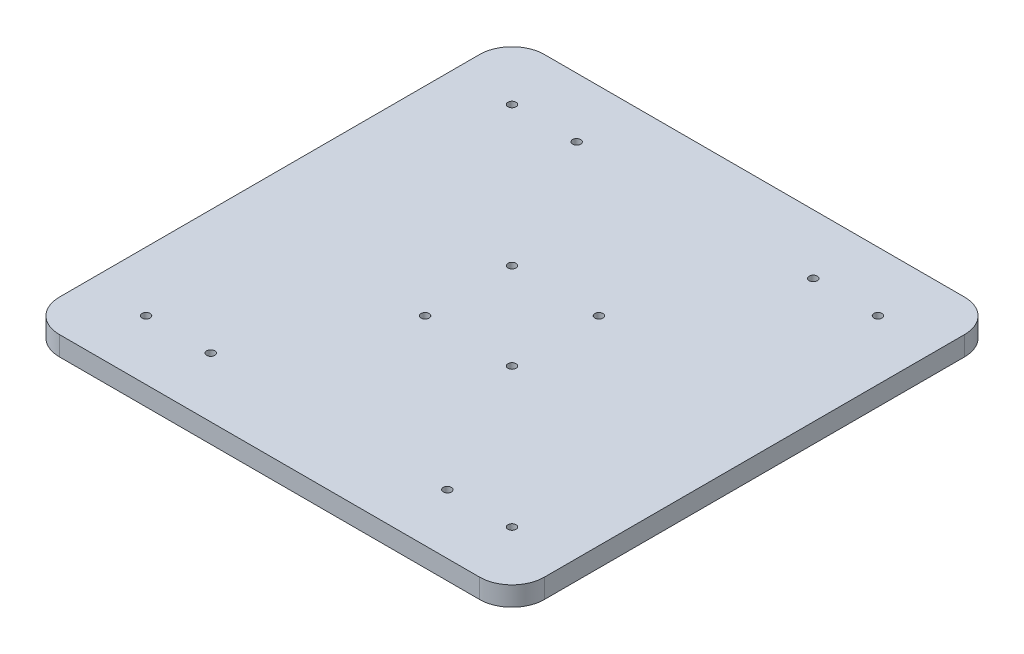
ISO-10303-21;
HEADER;
FILE_DESCRIPTION(('STEP AP214'),'2;1');
FILE_NAME('part.step','',(''),(''),'','','');
FILE_SCHEMA(('AUTOMOTIVE_DESIGN { 1 0 10303 214 1 1 1 1 }'));
ENDSEC;
DATA;
#1=APPLICATION_CONTEXT('core data for automotive mechanical design processes');
#2=APPLICATION_PROTOCOL_DEFINITION('international standard','automotive_design',2000,#1);
#3=PRODUCT_CONTEXT('',#1,'mechanical');
#4=PRODUCT('Part','Part','',(#3));
#5=PRODUCT_RELATED_PRODUCT_CATEGORY('part','',(#4));
#6=PRODUCT_DEFINITION_FORMATION('','',#4);
#7=PRODUCT_DEFINITION_CONTEXT('part definition',#1,'design');
#8=PRODUCT_DEFINITION('design','',#6,#7);
#9=PRODUCT_DEFINITION_SHAPE('','',#8);
#10=(LENGTH_UNIT() NAMED_UNIT(*) SI_UNIT(.MILLI.,.METRE.));
#11=(NAMED_UNIT(*) PLANE_ANGLE_UNIT() SI_UNIT($,.RADIAN.));
#12=(NAMED_UNIT(*) SI_UNIT($,.STERADIAN.) SOLID_ANGLE_UNIT());
#13=UNCERTAINTY_MEASURE_WITH_UNIT(LENGTH_MEASURE(1.E-05),#10,'distance_accuracy_value','');
#14=(GEOMETRIC_REPRESENTATION_CONTEXT(3) GLOBAL_UNCERTAINTY_ASSIGNED_CONTEXT((#13)) GLOBAL_UNIT_ASSIGNED_CONTEXT((#10,
#11,#12)) REPRESENTATION_CONTEXT('',''));
#15=CARTESIAN_POINT('',(0.,0.,0.));
#16=DIRECTION('',(0.,0.,1.));
#17=DIRECTION('',(1.,0.,0.));
#18=AXIS2_PLACEMENT_3D('',#15,#16,#17);
#19=CARTESIAN_POINT('',(75.,6.,-75.));
#20=DIRECTION('',(-1.,0.,0.));
#21=DIRECTION('',(0.,0.,1.));
#22=AXIS2_PLACEMENT_3D('',#19,#20,#21);
#23=PLANE('',#22);
#24=DIRECTION('',(0.,0.,-1.));
#25=VECTOR('',#24,1.);
#26=CARTESIAN_POINT('',(75.,6.,-75.));
#27=LINE('',#26,#25);
#28=CARTESIAN_POINT('',(75.,6.,65.));
#29=VERTEX_POINT('',#28);
#30=CARTESIAN_POINT('',(75.,6.,-65.));
#31=VERTEX_POINT('',#30);
#32=EDGE_CURVE('E143',#29,#31,#27,.T.);
#33=ORIENTED_EDGE('',*,*,#32,.F.);
#34=DIRECTION('',(0.,-1.,0.));
#35=VECTOR('',#34,1.);
#36=CARTESIAN_POINT('',(75.,6.,65.));
#37=LINE('',#36,#35);
#38=CARTESIAN_POINT('',(75.,0.,65.));
#39=VERTEX_POINT('',#38);
#40=EDGE_CURVE('E184',#29,#39,#37,.T.);
#41=ORIENTED_EDGE('',*,*,#40,.T.);
#42=DIRECTION('',(0.,0.,-1.));
#43=VECTOR('',#42,1.);
#44=CARTESIAN_POINT('',(75.,0.,-75.));
#45=LINE('',#44,#43);
#46=CARTESIAN_POINT('',(75.,0.,-65.));
#47=VERTEX_POINT('',#46);
#48=EDGE_CURVE('E230',#39,#47,#45,.T.);
#49=ORIENTED_EDGE('',*,*,#48,.T.);
#50=DIRECTION('',(0.,-1.,0.));
#51=VECTOR('',#50,1.);
#52=CARTESIAN_POINT('',(75.,6.,-65.));
#53=LINE('',#52,#51);
#54=EDGE_CURVE('E181',#47,#31,#53,.F.);
#55=ORIENTED_EDGE('',*,*,#54,.T.);
#56=EDGE_LOOP('',(#33,#41,#49,#55));
#57=FACE_BOUND('',#56,.T.);
#58=ADVANCED_FACE('F47',(#57),#23,.F.);
#59=CARTESIAN_POINT('',(-75.,6.,-75.));
#60=DIRECTION('',(0.,0.,1.));
#61=DIRECTION('',(1.,0.,0.));
#62=AXIS2_PLACEMENT_3D('',#59,#60,#61);
#63=PLANE('',#62);
#64=DIRECTION('',(-1.,0.,0.));
#65=VECTOR('',#64,1.);
#66=CARTESIAN_POINT('',(-75.,6.,-75.));
#67=LINE('',#66,#65);
#68=CARTESIAN_POINT('',(65.,6.,-75.));
#69=VERTEX_POINT('',#68);
#70=CARTESIAN_POINT('',(-65.,6.,-75.));
#71=VERTEX_POINT('',#70);
#72=EDGE_CURVE('E149',#69,#71,#67,.T.);
#73=ORIENTED_EDGE('',*,*,#72,.F.);
#74=DIRECTION('',(0.,-1.,0.));
#75=VECTOR('',#74,1.);
#76=CARTESIAN_POINT('',(65.,6.,-75.));
#77=LINE('',#76,#75);
#78=CARTESIAN_POINT('',(65.,0.,-75.));
#79=VERTEX_POINT('',#78);
#80=EDGE_CURVE('E11',#69,#79,#77,.T.);
#81=ORIENTED_EDGE('',*,*,#80,.T.);
#82=DIRECTION('',(-1.,0.,0.));
#83=VECTOR('',#82,1.);
#84=CARTESIAN_POINT('',(-75.,0.,-75.));
#85=LINE('',#84,#83);
#86=CARTESIAN_POINT('',(-65.,0.,-75.));
#87=VERTEX_POINT('',#86);
#88=EDGE_CURVE('E152',#79,#87,#85,.T.);
#89=ORIENTED_EDGE('',*,*,#88,.T.);
#90=DIRECTION('',(0.,-1.,0.));
#91=VECTOR('',#90,1.);
#92=CARTESIAN_POINT('',(-65.,6.,-75.));
#93=LINE('',#92,#91);
#94=EDGE_CURVE('E56',#87,#71,#93,.F.);
#95=ORIENTED_EDGE('',*,*,#94,.T.);
#96=EDGE_LOOP('',(#73,#81,#89,#95));
#97=FACE_BOUND('',#96,.T.);
#98=ADVANCED_FACE('F384',(#97),#63,.F.);
#99=CARTESIAN_POINT('',(-75.,6.,-75.));
#100=DIRECTION('',(1.,0.,0.));
#101=DIRECTION('',(0.,0.,-1.));
#102=AXIS2_PLACEMENT_3D('',#99,#100,#101);
#103=PLANE('',#102);
#104=DIRECTION('',(0.,0.,1.));
#105=VECTOR('',#104,1.);
#106=CARTESIAN_POINT('',(-75.,0.,-75.));
#107=LINE('',#106,#105);
#108=CARTESIAN_POINT('',(-75.,0.,-65.));
#109=VERTEX_POINT('',#108);
#110=CARTESIAN_POINT('',(-75.,0.,65.));
#111=VERTEX_POINT('',#110);
#112=EDGE_CURVE('E144',#109,#111,#107,.T.);
#113=ORIENTED_EDGE('',*,*,#112,.T.);
#114=DIRECTION('',(0.,-1.,0.));
#115=VECTOR('',#114,1.);
#116=CARTESIAN_POINT('',(-75.,6.,65.));
#117=LINE('',#116,#115);
#118=CARTESIAN_POINT('',(-75.,6.,65.));
#119=VERTEX_POINT('',#118);
#120=EDGE_CURVE('E119',#111,#119,#117,.F.);
#121=ORIENTED_EDGE('',*,*,#120,.T.);
#122=DIRECTION('',(0.,0.,1.));
#123=VECTOR('',#122,1.);
#124=CARTESIAN_POINT('',(-75.,6.,-75.));
#125=LINE('',#124,#123);
#126=CARTESIAN_POINT('',(-75.,6.,-65.));
#127=VERTEX_POINT('',#126);
#128=EDGE_CURVE('E291',#127,#119,#125,.T.);
#129=ORIENTED_EDGE('',*,*,#128,.F.);
#130=DIRECTION('',(0.,-1.,0.));
#131=VECTOR('',#130,1.);
#132=CARTESIAN_POINT('',(-75.,6.,-65.));
#133=LINE('',#132,#131);
#134=EDGE_CURVE('E125',#127,#109,#133,.T.);
#135=ORIENTED_EDGE('',*,*,#134,.T.);
#136=EDGE_LOOP('',(#113,#121,#129,#135));
#137=FACE_BOUND('',#136,.T.);
#138=ADVANCED_FACE('F389',(#137),#103,.F.);
#139=CARTESIAN_POINT('',(-75.,6.,75.));
#140=DIRECTION('',(0.,0.,-1.));
#141=DIRECTION('',(-1.,0.,0.));
#142=AXIS2_PLACEMENT_3D('',#139,#140,#141);
#143=PLANE('',#142);
#144=DIRECTION('',(1.,0.,0.));
#145=VECTOR('',#144,1.);
#146=CARTESIAN_POINT('',(-75.,6.,75.));
#147=LINE('',#146,#145);
#148=CARTESIAN_POINT('',(-65.,6.,75.));
#149=VERTEX_POINT('',#148);
#150=CARTESIAN_POINT('',(65.,6.,75.));
#151=VERTEX_POINT('',#150);
#152=EDGE_CURVE('E135',#149,#151,#147,.T.);
#153=ORIENTED_EDGE('',*,*,#152,.F.);
#154=DIRECTION('',(0.,-1.,0.));
#155=VECTOR('',#154,1.);
#156=CARTESIAN_POINT('',(-65.,6.,75.));
#157=LINE('',#156,#155);
#158=CARTESIAN_POINT('',(-65.,0.,75.));
#159=VERTEX_POINT('',#158);
#160=EDGE_CURVE('E118',#149,#159,#157,.T.);
#161=ORIENTED_EDGE('',*,*,#160,.T.);
#162=DIRECTION('',(1.,0.,0.));
#163=VECTOR('',#162,1.);
#164=CARTESIAN_POINT('',(-75.,0.,75.));
#165=LINE('',#164,#163);
#166=CARTESIAN_POINT('',(65.,0.,75.));
#167=VERTEX_POINT('',#166);
#168=EDGE_CURVE('E132',#159,#167,#165,.T.);
#169=ORIENTED_EDGE('',*,*,#168,.T.);
#170=DIRECTION('',(0.,-1.,0.));
#171=VECTOR('',#170,1.);
#172=CARTESIAN_POINT('',(65.,6.,75.));
#173=LINE('',#172,#171);
#174=EDGE_CURVE('E138',#167,#151,#173,.F.);
#175=ORIENTED_EDGE('',*,*,#174,.T.);
#176=EDGE_LOOP('',(#153,#161,#169,#175));
#177=FACE_BOUND('',#176,.T.);
#178=ADVANCED_FACE('F131',(#177),#143,.F.);
#179=CARTESIAN_POINT('',(0.,6.,0.));
#180=DIRECTION('',(0.,1.,0.));
#181=DIRECTION('',(0.,0.,1.));
#182=AXIS2_PLACEMENT_3D('',#179,#180,#181);
#183=PLANE('',#182);
#184=CARTESIAN_POINT('',(-13.4350288425443,6.,13.4350288425445));
#185=DIRECTION('',(0.,1.,0.));
#186=DIRECTION('',(0.,0.,1.));
#187=AXIS2_PLACEMENT_3D('',#184,#185,#186);
#188=CIRCLE('',#187,1.25);
#189=CARTESIAN_POINT('',(-13.4350288425443,6.,14.6850288425445));
#190=VERTEX_POINT('',#189);
#191=EDGE_CURVE('E256',#190,#190,#188,.T.);
#192=ORIENTED_EDGE('',*,*,#191,.F.);
#193=EDGE_LOOP('',(#192));
#194=FACE_BOUND('',#193,.T.);
#195=CARTESIAN_POINT('',(-13.4350288425445,6.,-13.4350288425443));
#196=DIRECTION('',(0.,1.,0.));
#197=DIRECTION('',(0.,0.,1.));
#198=AXIS2_PLACEMENT_3D('',#195,#196,#197);
#199=CIRCLE('',#198,1.25);
#200=CARTESIAN_POINT('',(-13.4350288425445,6.,-12.1850288425443));
#201=VERTEX_POINT('',#200);
#202=EDGE_CURVE('E260',#201,#201,#199,.T.);
#203=ORIENTED_EDGE('',*,*,#202,.F.);
#204=EDGE_LOOP('',(#203));
#205=FACE_BOUND('',#204,.T.);
#206=CARTESIAN_POINT('',(13.4350288425444,6.,-13.4350288425444));
#207=DIRECTION('',(0.,1.,0.));
#208=DIRECTION('',(0.,0.,1.));
#209=AXIS2_PLACEMENT_3D('',#206,#207,#208);
#210=CIRCLE('',#209,1.25);
#211=CARTESIAN_POINT('',(13.4350288425444,6.,-12.1850288425444));
#212=VERTEX_POINT('',#211);
#213=EDGE_CURVE('E197',#212,#212,#210,.T.);
#214=ORIENTED_EDGE('',*,*,#213,.F.);
#215=EDGE_LOOP('',(#214));
#216=FACE_BOUND('',#215,.T.);
#217=CARTESIAN_POINT('',(13.4350288425444,6.,13.4350288425444));
#218=DIRECTION('',(0.,1.,0.));
#219=DIRECTION('',(0.,0.,1.));
#220=AXIS2_PLACEMENT_3D('',#217,#218,#219);
#221=CIRCLE('',#220,1.25);
#222=CARTESIAN_POINT('',(13.4350288425444,6.,14.6850288425444));
#223=VERTEX_POINT('',#222);
#224=EDGE_CURVE('E194',#223,#223,#221,.T.);
#225=ORIENTED_EDGE('',*,*,#224,.F.);
#226=EDGE_LOOP('',(#225));
#227=FACE_BOUND('',#226,.T.);
#228=CARTESIAN_POINT('',(36.5685424949238,6.,56.5685424949237));
#229=DIRECTION('',(0.,1.,0.));
#230=DIRECTION('',(0.,0.,1.));
#231=AXIS2_PLACEMENT_3D('',#228,#229,#230);
#232=CIRCLE('',#231,1.25);
#233=CARTESIAN_POINT('',(36.5685424949238,6.,57.8185424949237));
#234=VERTEX_POINT('',#233);
#235=EDGE_CURVE('E238',#234,#234,#232,.T.);
#236=ORIENTED_EDGE('',*,*,#235,.F.);
#237=EDGE_LOOP('',(#236));
#238=FACE_BOUND('',#237,.T.);
#239=CARTESIAN_POINT('',(-36.5933251339775,6.,-56.5933251339774));
#240=DIRECTION('',(0.,1.,0.));
#241=DIRECTION('',(0.,0.,1.));
#242=AXIS2_PLACEMENT_3D('',#239,#240,#241);
#243=CIRCLE('',#242,1.25);
#244=CARTESIAN_POINT('',(-36.5933251339775,6.,-55.3433251339774));
#245=VERTEX_POINT('',#244);
#246=EDGE_CURVE('E313',#245,#245,#243,.T.);
#247=ORIENTED_EDGE('',*,*,#246,.F.);
#248=EDGE_LOOP('',(#247));
#249=FACE_BOUND('',#248,.T.);
#250=CARTESIAN_POINT('',(36.5685424949244,6.,-56.593325133977));
#251=DIRECTION('',(0.,1.,0.));
#252=DIRECTION('',(0.,0.,1.));
#253=AXIS2_PLACEMENT_3D('',#250,#251,#252);
#254=CIRCLE('',#253,1.25);
#255=CARTESIAN_POINT('',(36.5685424949244,6.,-55.343325133977));
#256=VERTEX_POINT('',#255);
#257=EDGE_CURVE('E251',#256,#256,#254,.T.);
#258=ORIENTED_EDGE('',*,*,#257,.F.);
#259=EDGE_LOOP('',(#258));
#260=FACE_BOUND('',#259,.T.);
#261=CARTESIAN_POINT('',(-36.5933251339776,6.,56.5685424949236));
#262=DIRECTION('',(0.,1.,0.));
#263=DIRECTION('',(0.,0.,1.));
#264=AXIS2_PLACEMENT_3D('',#261,#262,#263);
#265=CIRCLE('',#264,1.25);
#266=CARTESIAN_POINT('',(-36.5933251339776,6.,57.8185424949236));
#267=VERTEX_POINT('',#266);
#268=EDGE_CURVE('E247',#267,#267,#265,.T.);
#269=ORIENTED_EDGE('',*,*,#268,.F.);
#270=EDGE_LOOP('',(#269));
#271=FACE_BOUND('',#270,.T.);
#272=CARTESIAN_POINT('',(-56.5933251339776,6.,56.5685424949236));
#273=DIRECTION('',(0.,-1.,0.));
#274=DIRECTION('',(1.,0.,0.));
#275=AXIS2_PLACEMENT_3D('',#272,#273,#274);
#276=CIRCLE('',#275,1.25);
#277=CARTESIAN_POINT('',(-55.3433251339776,6.,56.5685424949236));
#278=VERTEX_POINT('',#277);
#279=EDGE_CURVE('E219',#278,#278,#276,.T.);
#280=ORIENTED_EDGE('',*,*,#279,.T.);
#281=EDGE_LOOP('',(#280));
#282=FACE_BOUND('',#281,.T.);
#283=CARTESIAN_POINT('',(-56.5933251339775,6.,-56.5933251339774));
#284=DIRECTION('',(0.,-1.,0.));
#285=DIRECTION('',(0.,0.,1.));
#286=AXIS2_PLACEMENT_3D('',#283,#284,#285);
#287=CIRCLE('',#286,1.25);
#288=CARTESIAN_POINT('',(-56.5933251339775,6.,-55.3433251339774));
#289=VERTEX_POINT('',#288);
#290=EDGE_CURVE('E277',#289,#289,#287,.T.);
#291=ORIENTED_EDGE('',*,*,#290,.T.);
#292=EDGE_LOOP('',(#291));
#293=FACE_BOUND('',#292,.T.);
#294=CARTESIAN_POINT('',(56.5685424949244,6.,-56.5933251339768));
#295=DIRECTION('',(0.,-1.,0.));
#296=DIRECTION('',(-1.,0.,0.));
#297=AXIS2_PLACEMENT_3D('',#294,#295,#296);
#298=CIRCLE('',#297,1.25);
#299=CARTESIAN_POINT('',(55.3185424949244,6.,-56.5933251339768));
#300=VERTEX_POINT('',#299);
#301=EDGE_CURVE('E237',#300,#300,#298,.T.);
#302=ORIENTED_EDGE('',*,*,#301,.T.);
#303=EDGE_LOOP('',(#302));
#304=FACE_BOUND('',#303,.T.);
#305=CARTESIAN_POINT('',(56.5685424949238,6.,56.5685424949238));
#306=DIRECTION('',(0.,-1.,0.));
#307=DIRECTION('',(0.,0.,-1.));
#308=AXIS2_PLACEMENT_3D('',#305,#306,#307);
#309=CIRCLE('',#308,1.25);
#310=CARTESIAN_POINT('',(56.5685424949238,6.,55.3185424949238));
#311=VERTEX_POINT('',#310);
#312=EDGE_CURVE('E242',#311,#311,#309,.T.);
#313=ORIENTED_EDGE('',*,*,#312,.T.);
#314=EDGE_LOOP('',(#313));
#315=FACE_BOUND('',#314,.T.);
#316=ORIENTED_EDGE('',*,*,#128,.T.);
#317=CARTESIAN_POINT('',(-65.,6.,65.));
#318=DIRECTION('',(0.,1.,0.));
#319=DIRECTION('',(0.,0.,1.));
#320=AXIS2_PLACEMENT_3D('',#317,#318,#319);
#321=CIRCLE('',#320,10.);
#322=EDGE_CURVE('E178',#119,#149,#321,.T.);
#323=ORIENTED_EDGE('',*,*,#322,.T.);
#324=ORIENTED_EDGE('',*,*,#152,.T.);
#325=CARTESIAN_POINT('',(65.,6.,65.));
#326=DIRECTION('',(0.,1.,0.));
#327=DIRECTION('',(0.,0.,1.));
#328=AXIS2_PLACEMENT_3D('',#325,#326,#327);
#329=CIRCLE('',#328,10.);
#330=EDGE_CURVE('E175',#151,#29,#329,.T.);
#331=ORIENTED_EDGE('',*,*,#330,.T.);
#332=ORIENTED_EDGE('',*,*,#32,.T.);
#333=CARTESIAN_POINT('',(65.,6.,-65.));
#334=DIRECTION('',(0.,1.,0.));
#335=DIRECTION('',(0.,0.,1.));
#336=AXIS2_PLACEMENT_3D('',#333,#334,#335);
#337=CIRCLE('',#336,10.);
#338=EDGE_CURVE('E69',#31,#69,#337,.T.);
#339=ORIENTED_EDGE('',*,*,#338,.T.);
#340=ORIENTED_EDGE('',*,*,#72,.T.);
#341=CARTESIAN_POINT('',(-65.,6.,-65.));
#342=DIRECTION('',(0.,1.,0.));
#343=DIRECTION('',(0.,0.,1.));
#344=AXIS2_PLACEMENT_3D('',#341,#342,#343);
#345=CIRCLE('',#344,10.);
#346=EDGE_CURVE('E170',#71,#127,#345,.T.);
#347=ORIENTED_EDGE('',*,*,#346,.T.);
#348=EDGE_LOOP('',(#316,#323,#324,#331,#332,#339,#340,#347));
#349=FACE_BOUND('',#348,.T.);
#350=ADVANCED_FACE('F343',(#194,#205,#216,#227,#238,#249,#260,#271,#282,#293,#304,#315,#349),
#183,.T.);
#351=CARTESIAN_POINT('',(0.,0.,0.));
#352=DIRECTION('',(0.,1.,0.));
#353=DIRECTION('',(0.,0.,1.));
#354=AXIS2_PLACEMENT_3D('',#351,#352,#353);
#355=PLANE('',#354);
#356=CARTESIAN_POINT('',(-13.4350288425443,0.,13.4350288425445));
#357=DIRECTION('',(0.,-1.,0.));
#358=DIRECTION('',(0.,0.,-1.));
#359=AXIS2_PLACEMENT_3D('',#356,#357,#358);
#360=CIRCLE('',#359,1.25);
#361=CARTESIAN_POINT('',(-13.4350288425443,0.,12.1850288425445));
#362=VERTEX_POINT('',#361);
#363=EDGE_CURVE('E212',#362,#362,#360,.T.);
#364=ORIENTED_EDGE('',*,*,#363,.F.);
#365=EDGE_LOOP('',(#364));
#366=FACE_BOUND('',#365,.T.);
#367=CARTESIAN_POINT('',(-13.4350288425445,0.,-13.4350288425443));
#368=DIRECTION('',(0.,-1.,0.));
#369=DIRECTION('',(0.,0.,-1.));
#370=AXIS2_PLACEMENT_3D('',#367,#368,#369);
#371=CIRCLE('',#370,1.25);
#372=CARTESIAN_POINT('',(-13.4350288425445,0.,-14.6850288425443));
#373=VERTEX_POINT('',#372);
#374=EDGE_CURVE('E208',#373,#373,#371,.T.);
#375=ORIENTED_EDGE('',*,*,#374,.F.);
#376=EDGE_LOOP('',(#375));
#377=FACE_BOUND('',#376,.T.);
#378=CARTESIAN_POINT('',(13.4350288425444,0.,-13.4350288425444));
#379=DIRECTION('',(0.,-1.,0.));
#380=DIRECTION('',(0.,0.,-1.));
#381=AXIS2_PLACEMENT_3D('',#378,#379,#380);
#382=CIRCLE('',#381,1.25);
#383=CARTESIAN_POINT('',(13.4350288425444,0.,-14.6850288425444));
#384=VERTEX_POINT('',#383);
#385=EDGE_CURVE('E211',#384,#384,#382,.T.);
#386=ORIENTED_EDGE('',*,*,#385,.F.);
#387=EDGE_LOOP('',(#386));
#388=FACE_BOUND('',#387,.T.);
#389=CARTESIAN_POINT('',(13.4350288425444,0.,13.4350288425444));
#390=DIRECTION('',(0.,-1.,0.));
#391=DIRECTION('',(0.,0.,-1.));
#392=AXIS2_PLACEMENT_3D('',#389,#390,#391);
#393=CIRCLE('',#392,1.25);
#394=CARTESIAN_POINT('',(13.4350288425444,0.,12.1850288425444));
#395=VERTEX_POINT('',#394);
#396=EDGE_CURVE('E198',#395,#395,#393,.T.);
#397=ORIENTED_EDGE('',*,*,#396,.F.);
#398=EDGE_LOOP('',(#397));
#399=FACE_BOUND('',#398,.T.);
#400=CARTESIAN_POINT('',(36.5685424949238,0.,56.5685424949237));
#401=DIRECTION('',(0.,-1.,0.));
#402=DIRECTION('',(0.,0.,-1.));
#403=AXIS2_PLACEMENT_3D('',#400,#401,#402);
#404=CIRCLE('',#403,1.25);
#405=CARTESIAN_POINT('',(36.5685424949238,0.,55.3185424949237));
#406=VERTEX_POINT('',#405);
#407=EDGE_CURVE('E323',#406,#406,#404,.T.);
#408=ORIENTED_EDGE('',*,*,#407,.F.);
#409=EDGE_LOOP('',(#408));
#410=FACE_BOUND('',#409,.T.);
#411=CARTESIAN_POINT('',(-36.5933251339775,0.,-56.5933251339774));
#412=DIRECTION('',(0.,-1.,0.));
#413=DIRECTION('',(0.,0.,-1.));
#414=AXIS2_PLACEMENT_3D('',#411,#412,#413);
#415=CIRCLE('',#414,1.25);
#416=CARTESIAN_POINT('',(-36.5933251339775,0.,-57.8433251339774));
#417=VERTEX_POINT('',#416);
#418=EDGE_CURVE('E324',#417,#417,#415,.T.);
#419=ORIENTED_EDGE('',*,*,#418,.F.);
#420=EDGE_LOOP('',(#419));
#421=FACE_BOUND('',#420,.T.);
#422=CARTESIAN_POINT('',(36.5685424949244,0.,-56.593325133977));
#423=DIRECTION('',(0.,-1.,0.));
#424=DIRECTION('',(0.,0.,-1.));
#425=AXIS2_PLACEMENT_3D('',#422,#423,#424);
#426=CIRCLE('',#425,1.25);
#427=CARTESIAN_POINT('',(36.5685424949244,0.,-57.843325133977));
#428=VERTEX_POINT('',#427);
#429=EDGE_CURVE('E259',#428,#428,#426,.T.);
#430=ORIENTED_EDGE('',*,*,#429,.F.);
#431=EDGE_LOOP('',(#430));
#432=FACE_BOUND('',#431,.T.);
#433=CARTESIAN_POINT('',(-36.5933251339776,0.,56.5685424949236));
#434=DIRECTION('',(0.,-1.,0.));
#435=DIRECTION('',(0.,0.,-1.));
#436=AXIS2_PLACEMENT_3D('',#433,#434,#435);
#437=CIRCLE('',#436,1.25);
#438=CARTESIAN_POINT('',(-36.5933251339776,0.,55.3185424949236));
#439=VERTEX_POINT('',#438);
#440=EDGE_CURVE('E252',#439,#439,#437,.T.);
#441=ORIENTED_EDGE('',*,*,#440,.F.);
#442=EDGE_LOOP('',(#441));
#443=FACE_BOUND('',#442,.T.);
#444=CARTESIAN_POINT('',(-56.5933251339776,0.,56.5685424949236));
#445=DIRECTION('',(0.,-1.,0.));
#446=DIRECTION('',(1.,0.,0.));
#447=AXIS2_PLACEMENT_3D('',#444,#445,#446);
#448=CIRCLE('',#447,1.25);
#449=CARTESIAN_POINT('',(-55.3433251339776,0.,56.5685424949236));
#450=VERTEX_POINT('',#449);
#451=EDGE_CURVE('E224',#450,#450,#448,.T.);
#452=ORIENTED_EDGE('',*,*,#451,.F.);
#453=EDGE_LOOP('',(#452));
#454=FACE_BOUND('',#453,.T.);
#455=CARTESIAN_POINT('',(-56.5933251339775,0.,-56.5933251339774));
#456=DIRECTION('',(0.,-1.,0.));
#457=DIRECTION('',(0.,0.,1.));
#458=AXIS2_PLACEMENT_3D('',#455,#456,#457);
#459=CIRCLE('',#458,1.25);
#460=CARTESIAN_POINT('',(-56.5933251339775,0.,-55.3433251339774));
#461=VERTEX_POINT('',#460);
#462=EDGE_CURVE('E303',#461,#461,#459,.T.);
#463=ORIENTED_EDGE('',*,*,#462,.F.);
#464=EDGE_LOOP('',(#463));
#465=FACE_BOUND('',#464,.T.);
#466=CARTESIAN_POINT('',(56.5685424949244,0.,-56.5933251339768));
#467=DIRECTION('',(0.,-1.,0.));
#468=DIRECTION('',(-1.,0.,0.));
#469=AXIS2_PLACEMENT_3D('',#466,#467,#468);
#470=CIRCLE('',#469,1.25);
#471=CARTESIAN_POINT('',(55.3185424949244,0.,-56.5933251339768));
#472=VERTEX_POINT('',#471);
#473=EDGE_CURVE('E233',#472,#472,#470,.T.);
#474=ORIENTED_EDGE('',*,*,#473,.F.);
#475=EDGE_LOOP('',(#474));
#476=FACE_BOUND('',#475,.T.);
#477=CARTESIAN_POINT('',(56.5685424949238,0.,56.5685424949238));
#478=DIRECTION('',(0.,-1.,0.));
#479=DIRECTION('',(0.,0.,-1.));
#480=AXIS2_PLACEMENT_3D('',#477,#478,#479);
#481=CIRCLE('',#480,1.25);
#482=CARTESIAN_POINT('',(56.5685424949238,0.,55.3185424949238));
#483=VERTEX_POINT('',#482);
#484=EDGE_CURVE('E223',#483,#483,#481,.T.);
#485=ORIENTED_EDGE('',*,*,#484,.F.);
#486=EDGE_LOOP('',(#485));
#487=FACE_BOUND('',#486,.T.);
#488=ORIENTED_EDGE('',*,*,#168,.F.);
#489=CARTESIAN_POINT('',(-65.,0.,65.));
#490=DIRECTION('',(0.,1.,0.));
#491=DIRECTION('',(0.,0.,1.));
#492=AXIS2_PLACEMENT_3D('',#489,#490,#491);
#493=CIRCLE('',#492,10.);
#494=EDGE_CURVE('E114',#159,#111,#493,.F.);
#495=ORIENTED_EDGE('',*,*,#494,.T.);
#496=ORIENTED_EDGE('',*,*,#112,.F.);
#497=CARTESIAN_POINT('',(-65.,0.,-65.));
#498=DIRECTION('',(0.,1.,0.));
#499=DIRECTION('',(0.,0.,1.));
#500=AXIS2_PLACEMENT_3D('',#497,#498,#499);
#501=CIRCLE('',#500,10.);
#502=EDGE_CURVE('E137',#109,#87,#501,.F.);
#503=ORIENTED_EDGE('',*,*,#502,.T.);
#504=ORIENTED_EDGE('',*,*,#88,.F.);
#505=CARTESIAN_POINT('',(65.,0.,-65.));
#506=DIRECTION('',(0.,1.,0.));
#507=DIRECTION('',(0.,0.,1.));
#508=AXIS2_PLACEMENT_3D('',#505,#506,#507);
#509=CIRCLE('',#508,10.);
#510=EDGE_CURVE('E160',#79,#47,#509,.F.);
#511=ORIENTED_EDGE('',*,*,#510,.T.);
#512=ORIENTED_EDGE('',*,*,#48,.F.);
#513=CARTESIAN_POINT('',(65.,0.,65.));
#514=DIRECTION('',(0.,1.,0.));
#515=DIRECTION('',(0.,0.,1.));
#516=AXIS2_PLACEMENT_3D('',#513,#514,#515);
#517=CIRCLE('',#516,10.);
#518=EDGE_CURVE('E126',#39,#167,#517,.F.);
#519=ORIENTED_EDGE('',*,*,#518,.T.);
#520=EDGE_LOOP('',(#488,#495,#496,#503,#504,#511,#512,#519));
#521=FACE_BOUND('',#520,.T.);
#522=ADVANCED_FACE('F140',(#366,#377,#388,#399,#410,#421,#432,#443,#454,#465,#476,#487,#521),
#355,.F.);
#523=CARTESIAN_POINT('',(-65.,6.,65.));
#524=DIRECTION('',(0.,-1.,0.));
#525=DIRECTION('',(0.,0.,-1.));
#526=AXIS2_PLACEMENT_3D('',#523,#524,#525);
#527=CYLINDRICAL_SURFACE('',#526,10.);
#528=ORIENTED_EDGE('',*,*,#322,.F.);
#529=ORIENTED_EDGE('',*,*,#120,.F.);
#530=ORIENTED_EDGE('',*,*,#494,.F.);
#531=ORIENTED_EDGE('',*,*,#160,.F.);
#532=EDGE_LOOP('',(#528,#529,#530,#531));
#533=FACE_BOUND('',#532,.T.);
#534=ADVANCED_FACE('F117',(#533),#527,.T.);
#535=CARTESIAN_POINT('',(65.,6.,65.));
#536=DIRECTION('',(0.,-1.,0.));
#537=DIRECTION('',(0.,0.,-1.));
#538=AXIS2_PLACEMENT_3D('',#535,#536,#537);
#539=CYLINDRICAL_SURFACE('',#538,10.);
#540=ORIENTED_EDGE('',*,*,#330,.F.);
#541=ORIENTED_EDGE('',*,*,#174,.F.);
#542=ORIENTED_EDGE('',*,*,#518,.F.);
#543=ORIENTED_EDGE('',*,*,#40,.F.);
#544=EDGE_LOOP('',(#540,#541,#542,#543));
#545=FACE_BOUND('',#544,.T.);
#546=ADVANCED_FACE('F396',(#545),#539,.T.);
#547=CARTESIAN_POINT('',(65.,6.,-65.));
#548=DIRECTION('',(0.,-1.,0.));
#549=DIRECTION('',(0.,0.,-1.));
#550=AXIS2_PLACEMENT_3D('',#547,#548,#549);
#551=CYLINDRICAL_SURFACE('',#550,10.);
#552=ORIENTED_EDGE('',*,*,#338,.F.);
#553=ORIENTED_EDGE('',*,*,#54,.F.);
#554=ORIENTED_EDGE('',*,*,#510,.F.);
#555=ORIENTED_EDGE('',*,*,#80,.F.);
#556=EDGE_LOOP('',(#552,#553,#554,#555));
#557=FACE_BOUND('',#556,.T.);
#558=ADVANCED_FACE('F379',(#557),#551,.T.);
#559=CARTESIAN_POINT('',(-65.,6.,-65.));
#560=DIRECTION('',(0.,-1.,0.));
#561=DIRECTION('',(0.,0.,-1.));
#562=AXIS2_PLACEMENT_3D('',#559,#560,#561);
#563=CYLINDRICAL_SURFACE('',#562,10.);
#564=ORIENTED_EDGE('',*,*,#346,.F.);
#565=ORIENTED_EDGE('',*,*,#94,.F.);
#566=ORIENTED_EDGE('',*,*,#502,.F.);
#567=ORIENTED_EDGE('',*,*,#134,.F.);
#568=EDGE_LOOP('',(#564,#565,#566,#567));
#569=FACE_BOUND('',#568,.T.);
#570=ADVANCED_FACE('F49',(#569),#563,.T.);
#571=CARTESIAN_POINT('',(56.5685424949238,6.,56.5685424949238));
#572=DIRECTION('',(0.,-1.,0.));
#573=DIRECTION('',(0.,0.,-1.));
#574=AXIS2_PLACEMENT_3D('',#571,#572,#573);
#575=CYLINDRICAL_SURFACE('',#574,1.25);
#576=ORIENTED_EDGE('',*,*,#312,.F.);
#577=EDGE_LOOP('',(#576));
#578=FACE_BOUND('',#577,.T.);
#579=ORIENTED_EDGE('',*,*,#484,.T.);
#580=EDGE_LOOP('',(#579));
#581=FACE_BOUND('',#580,.T.);
#582=ADVANCED_FACE('F367',(#578,#581),#575,.F.);
#583=CARTESIAN_POINT('',(56.5685424949244,6.,-56.5933251339768));
#584=DIRECTION('',(0.,-1.,0.));
#585=DIRECTION('',(0.,0.,-1.));
#586=AXIS2_PLACEMENT_3D('',#583,#584,#585);
#587=CYLINDRICAL_SURFACE('',#586,1.25);
#588=ORIENTED_EDGE('',*,*,#301,.F.);
#589=EDGE_LOOP('',(#588));
#590=FACE_BOUND('',#589,.T.);
#591=ORIENTED_EDGE('',*,*,#473,.T.);
#592=EDGE_LOOP('',(#591));
#593=FACE_BOUND('',#592,.T.);
#594=ADVANCED_FACE('F369',(#590,#593),#587,.F.);
#595=CARTESIAN_POINT('',(-56.5933251339775,6.,-56.5933251339774));
#596=DIRECTION('',(0.,-1.,0.));
#597=DIRECTION('',(0.,0.,-1.));
#598=AXIS2_PLACEMENT_3D('',#595,#596,#597);
#599=CYLINDRICAL_SURFACE('',#598,1.25);
#600=ORIENTED_EDGE('',*,*,#290,.F.);
#601=EDGE_LOOP('',(#600));
#602=FACE_BOUND('',#601,.T.);
#603=ORIENTED_EDGE('',*,*,#462,.T.);
#604=EDGE_LOOP('',(#603));
#605=FACE_BOUND('',#604,.T.);
#606=ADVANCED_FACE('F376',(#602,#605),#599,.F.);
#607=CARTESIAN_POINT('',(-56.5933251339776,6.,56.5685424949236));
#608=DIRECTION('',(0.,-1.,0.));
#609=DIRECTION('',(0.,0.,-1.));
#610=AXIS2_PLACEMENT_3D('',#607,#608,#609);
#611=CYLINDRICAL_SURFACE('',#610,1.25);
#612=ORIENTED_EDGE('',*,*,#279,.F.);
#613=EDGE_LOOP('',(#612));
#614=FACE_BOUND('',#613,.T.);
#615=ORIENTED_EDGE('',*,*,#451,.T.);
#616=EDGE_LOOP('',(#615));
#617=FACE_BOUND('',#616,.T.);
#618=ADVANCED_FACE('F470',(#614,#617),#611,.F.);
#619=CARTESIAN_POINT('',(-36.5933251339776,10.,56.5685424949236));
#620=DIRECTION('',(0.,-1.,0.));
#621=DIRECTION('',(0.,0.,-1.));
#622=AXIS2_PLACEMENT_3D('',#619,#620,#621);
#623=CYLINDRICAL_SURFACE('',#622,1.25);
#624=ORIENTED_EDGE('',*,*,#268,.T.);
#625=EDGE_LOOP('',(#624));
#626=FACE_BOUND('',#625,.T.);
#627=ORIENTED_EDGE('',*,*,#440,.T.);
#628=EDGE_LOOP('',(#627));
#629=FACE_BOUND('',#628,.T.);
#630=ADVANCED_FACE('F479',(#626,#629),#623,.F.);
#631=CARTESIAN_POINT('',(36.5685424949244,10.,-56.593325133977));
#632=DIRECTION('',(0.,-1.,0.));
#633=DIRECTION('',(0.,0.,-1.));
#634=AXIS2_PLACEMENT_3D('',#631,#632,#633);
#635=CYLINDRICAL_SURFACE('',#634,1.25);
#636=ORIENTED_EDGE('',*,*,#257,.T.);
#637=EDGE_LOOP('',(#636));
#638=FACE_BOUND('',#637,.T.);
#639=ORIENTED_EDGE('',*,*,#429,.T.);
#640=EDGE_LOOP('',(#639));
#641=FACE_BOUND('',#640,.T.);
#642=ADVANCED_FACE('F488',(#638,#641),#635,.F.);
#643=CARTESIAN_POINT('',(-36.5933251339775,10.,-56.5933251339774));
#644=DIRECTION('',(0.,-1.,0.));
#645=DIRECTION('',(0.,0.,-1.));
#646=AXIS2_PLACEMENT_3D('',#643,#644,#645);
#647=CYLINDRICAL_SURFACE('',#646,1.25);
#648=ORIENTED_EDGE('',*,*,#246,.T.);
#649=EDGE_LOOP('',(#648));
#650=FACE_BOUND('',#649,.T.);
#651=ORIENTED_EDGE('',*,*,#418,.T.);
#652=EDGE_LOOP('',(#651));
#653=FACE_BOUND('',#652,.T.);
#654=ADVANCED_FACE('F497',(#650,#653),#647,.F.);
#655=CARTESIAN_POINT('',(36.5685424949238,10.,56.5685424949237));
#656=DIRECTION('',(0.,-1.,0.));
#657=DIRECTION('',(0.,0.,-1.));
#658=AXIS2_PLACEMENT_3D('',#655,#656,#657);
#659=CYLINDRICAL_SURFACE('',#658,1.25);
#660=ORIENTED_EDGE('',*,*,#235,.T.);
#661=EDGE_LOOP('',(#660));
#662=FACE_BOUND('',#661,.T.);
#663=ORIENTED_EDGE('',*,*,#407,.T.);
#664=EDGE_LOOP('',(#663));
#665=FACE_BOUND('',#664,.T.);
#666=ADVANCED_FACE('F506',(#662,#665),#659,.F.);
#667=CARTESIAN_POINT('',(13.4350288425444,10.,13.4350288425444));
#668=DIRECTION('',(0.,-1.,0.));
#669=DIRECTION('',(0.,0.,-1.));
#670=AXIS2_PLACEMENT_3D('',#667,#668,#669);
#671=CYLINDRICAL_SURFACE('',#670,1.25);
#672=ORIENTED_EDGE('',*,*,#224,.T.);
#673=EDGE_LOOP('',(#672));
#674=FACE_BOUND('',#673,.T.);
#675=ORIENTED_EDGE('',*,*,#396,.T.);
#676=EDGE_LOOP('',(#675));
#677=FACE_BOUND('',#676,.T.);
#678=ADVANCED_FACE('F514',(#674,#677),#671,.F.);
#679=CARTESIAN_POINT('',(13.4350288425444,10.,-13.4350288425444));
#680=DIRECTION('',(0.,-1.,0.));
#681=DIRECTION('',(0.,0.,-1.));
#682=AXIS2_PLACEMENT_3D('',#679,#680,#681);
#683=CYLINDRICAL_SURFACE('',#682,1.25);
#684=ORIENTED_EDGE('',*,*,#213,.T.);
#685=EDGE_LOOP('',(#684));
#686=FACE_BOUND('',#685,.T.);
#687=ORIENTED_EDGE('',*,*,#385,.T.);
#688=EDGE_LOOP('',(#687));
#689=FACE_BOUND('',#688,.T.);
#690=ADVANCED_FACE('F522',(#686,#689),#683,.F.);
#691=CARTESIAN_POINT('',(-13.4350288425445,10.,-13.4350288425443));
#692=DIRECTION('',(0.,-1.,0.));
#693=DIRECTION('',(0.,0.,-1.));
#694=AXIS2_PLACEMENT_3D('',#691,#692,#693);
#695=CYLINDRICAL_SURFACE('',#694,1.25);
#696=ORIENTED_EDGE('',*,*,#202,.T.);
#697=EDGE_LOOP('',(#696));
#698=FACE_BOUND('',#697,.T.);
#699=ORIENTED_EDGE('',*,*,#374,.T.);
#700=EDGE_LOOP('',(#699));
#701=FACE_BOUND('',#700,.T.);
#702=ADVANCED_FACE('F531',(#698,#701),#695,.F.);
#703=CARTESIAN_POINT('',(-13.4350288425443,10.,13.4350288425445));
#704=DIRECTION('',(0.,-1.,0.));
#705=DIRECTION('',(0.,0.,-1.));
#706=AXIS2_PLACEMENT_3D('',#703,#704,#705);
#707=CYLINDRICAL_SURFACE('',#706,1.25);
#708=ORIENTED_EDGE('',*,*,#191,.T.);
#709=EDGE_LOOP('',(#708));
#710=FACE_BOUND('',#709,.T.);
#711=ORIENTED_EDGE('',*,*,#363,.T.);
#712=EDGE_LOOP('',(#711));
#713=FACE_BOUND('',#712,.T.);
#714=ADVANCED_FACE('F339',(#710,#713),#707,.F.);
#715=CLOSED_SHELL('',(#58,#98,#138,#178,#350,#522,#534,#546,#558,#570,#582,#594,#606,#618,#630,
#642,#654,#666,#678,#690,#702,#714));
#716=MANIFOLD_SOLID_BREP('B2',#715);
#717=ADVANCED_BREP_SHAPE_REPRESENTATION('',(#18,#716),#14);
#718=SHAPE_DEFINITION_REPRESENTATION(#9,#717);
ENDSEC;
END-ISO-10303-21;
